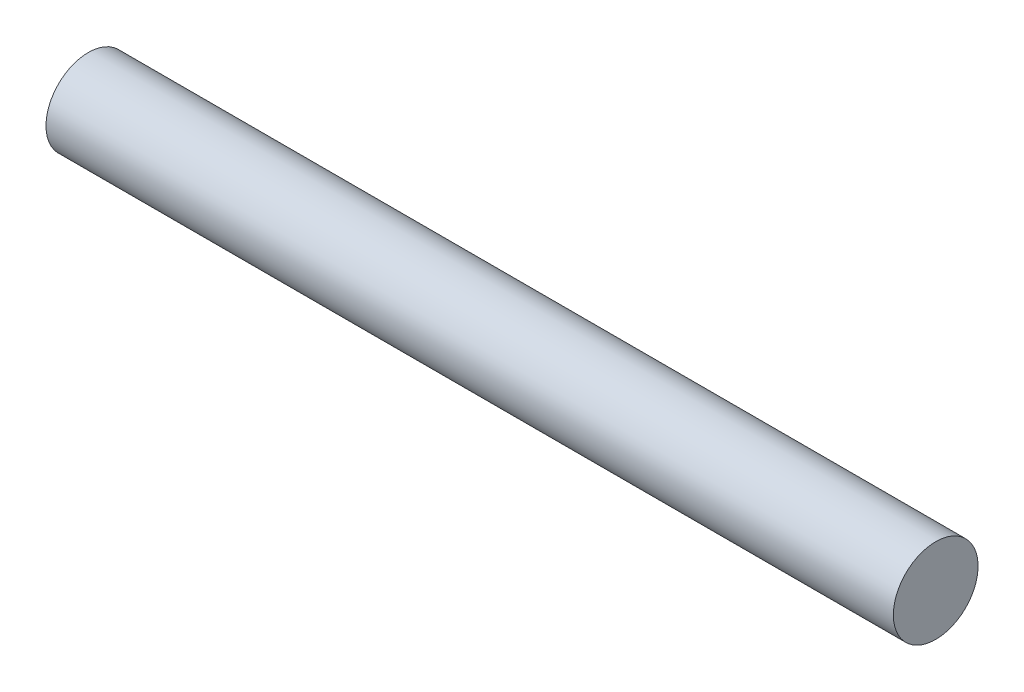
ISO-10303-21;
HEADER;
FILE_DESCRIPTION(('STEP AP214'),'2;1');
FILE_NAME('part.step','',(''),(''),'','','');
FILE_SCHEMA(('AUTOMOTIVE_DESIGN { 1 0 10303 214 1 1 1 1 }'));
ENDSEC;
DATA;
#1=APPLICATION_CONTEXT('core data for automotive mechanical design processes');
#2=APPLICATION_PROTOCOL_DEFINITION('international standard','automotive_design',2000,#1);
#3=PRODUCT_CONTEXT('',#1,'mechanical');
#4=PRODUCT('Part','Part','',(#3));
#5=PRODUCT_RELATED_PRODUCT_CATEGORY('part','',(#4));
#6=PRODUCT_DEFINITION_FORMATION('','',#4);
#7=PRODUCT_DEFINITION_CONTEXT('part definition',#1,'design');
#8=PRODUCT_DEFINITION('design','',#6,#7);
#9=PRODUCT_DEFINITION_SHAPE('','',#8);
#10=(LENGTH_UNIT() NAMED_UNIT(*) SI_UNIT(.MILLI.,.METRE.));
#11=(NAMED_UNIT(*) PLANE_ANGLE_UNIT() SI_UNIT($,.RADIAN.));
#12=(NAMED_UNIT(*) SI_UNIT($,.STERADIAN.) SOLID_ANGLE_UNIT());
#13=UNCERTAINTY_MEASURE_WITH_UNIT(LENGTH_MEASURE(1.E-05),#10,'distance_accuracy_value','');
#14=(GEOMETRIC_REPRESENTATION_CONTEXT(3) GLOBAL_UNCERTAINTY_ASSIGNED_CONTEXT((#13)) GLOBAL_UNIT_ASSIGNED_CONTEXT((#10,
#11,#12)) REPRESENTATION_CONTEXT('',''));
#15=CARTESIAN_POINT('',(0.,0.,0.));
#16=DIRECTION('',(0.,0.,1.));
#17=DIRECTION('',(1.,0.,0.));
#18=AXIS2_PLACEMENT_3D('',#15,#16,#17);
#19=CARTESIAN_POINT('',(12.5,0.,0.));
#20=DIRECTION('',(1.,0.,0.));
#21=DIRECTION('',(0.,0.,-1.));
#22=AXIS2_PLACEMENT_3D('',#19,#20,#21);
#23=PLANE('',#22);
#24=CARTESIAN_POINT('',(12.5,0.,0.));
#25=DIRECTION('',(-1.,0.,0.));
#26=DIRECTION('',(0.,0.,1.));
#27=AXIS2_PLACEMENT_3D('',#24,#25,#26);
#28=CIRCLE('',#27,1.25);
#29=CARTESIAN_POINT('',(12.5,0.,1.25));
#30=VERTEX_POINT('',#29);
#31=EDGE_CURVE('E17',#30,#30,#28,.T.);
#32=ORIENTED_EDGE('',*,*,#31,.F.);
#33=EDGE_LOOP('',(#32));
#34=FACE_BOUND('',#33,.T.);
#35=ADVANCED_FACE('F14',(#34),#23,.T.);
#36=CARTESIAN_POINT('',(-12.5,0.,0.));
#37=DIRECTION('',(1.,0.,0.));
#38=DIRECTION('',(0.,0.,-1.));
#39=AXIS2_PLACEMENT_3D('',#36,#37,#38);
#40=PLANE('',#39);
#41=CARTESIAN_POINT('',(-12.5,0.,0.));
#42=DIRECTION('',(-1.,0.,0.));
#43=DIRECTION('',(0.,0.,1.));
#44=AXIS2_PLACEMENT_3D('',#41,#42,#43);
#45=CIRCLE('',#44,1.25);
#46=CARTESIAN_POINT('',(-12.5,0.,1.25));
#47=VERTEX_POINT('',#46);
#48=EDGE_CURVE('E10',#47,#47,#45,.F.);
#49=ORIENTED_EDGE('',*,*,#48,.F.);
#50=EDGE_LOOP('',(#49));
#51=FACE_BOUND('',#50,.T.);
#52=ADVANCED_FACE('F29',(#51),#40,.F.);
#53=CARTESIAN_POINT('',(12.5,0.,0.));
#54=DIRECTION('',(-1.,0.,0.));
#55=DIRECTION('',(0.,0.,1.));
#56=AXIS2_PLACEMENT_3D('',#53,#54,#55);
#57=CYLINDRICAL_SURFACE('',#56,1.25);
#58=ORIENTED_EDGE('',*,*,#48,.T.);
#59=EDGE_LOOP('',(#58));
#60=FACE_BOUND('',#59,.T.);
#61=ORIENTED_EDGE('',*,*,#31,.T.);
#62=EDGE_LOOP('',(#61));
#63=FACE_BOUND('',#62,.T.);
#64=ADVANCED_FACE('F26',(#60,#63),#57,.T.);
#65=CLOSED_SHELL('',(#35,#52,#64));
#66=MANIFOLD_SOLID_BREP('B1',#65);
#67=ADVANCED_BREP_SHAPE_REPRESENTATION('',(#18,#66),#14);
#68=SHAPE_DEFINITION_REPRESENTATION(#9,#67);
ENDSEC;
END-ISO-10303-21;
